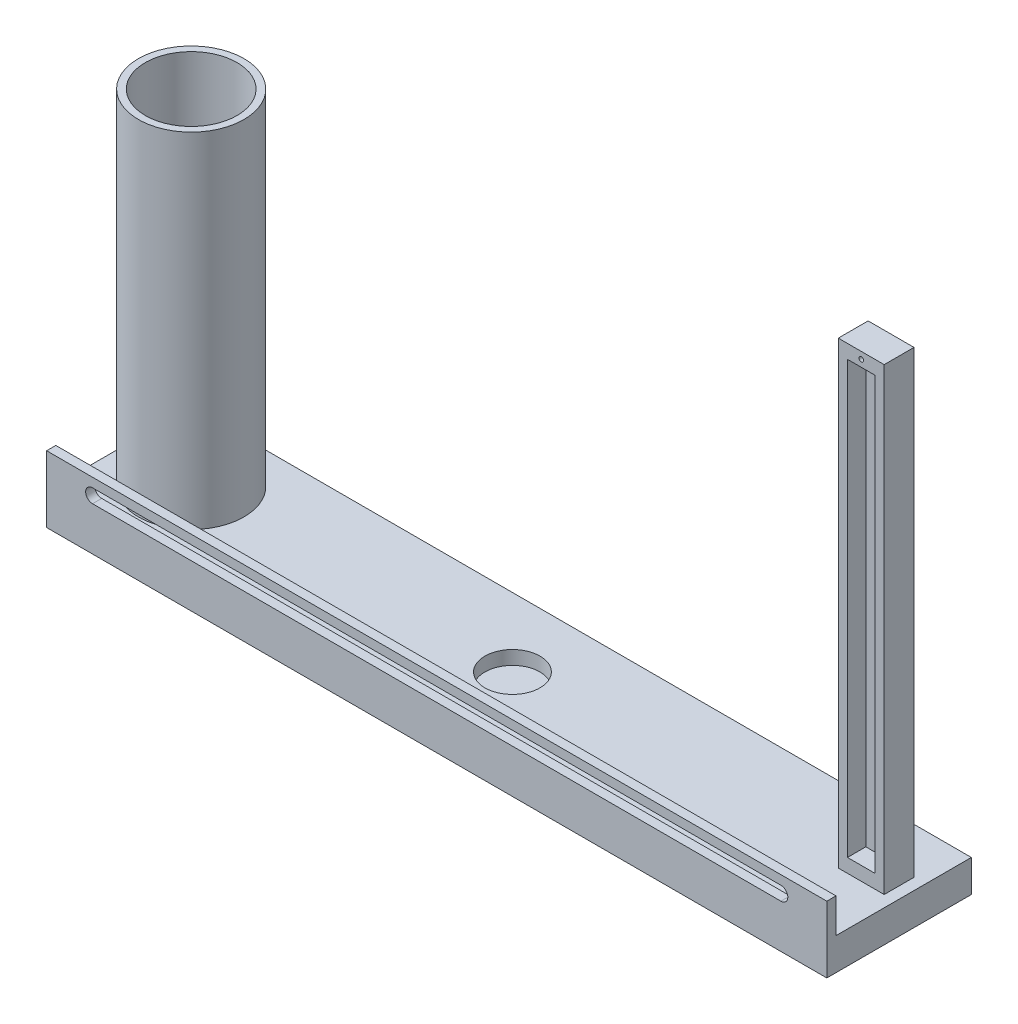
ISO-10303-21;
HEADER;
FILE_DESCRIPTION(('STEP AP214'),'2;1');
FILE_NAME('part.step','',(''),(''),'','','');
FILE_SCHEMA(('AUTOMOTIVE_DESIGN { 1 0 10303 214 1 1 1 1 }'));
ENDSEC;
DATA;
#1=APPLICATION_CONTEXT('core data for automotive mechanical design processes');
#2=APPLICATION_PROTOCOL_DEFINITION('international standard','automotive_design',2000,#1);
#3=PRODUCT_CONTEXT('',#1,'mechanical');
#4=PRODUCT('Part','Part','',(#3));
#5=PRODUCT_RELATED_PRODUCT_CATEGORY('part','',(#4));
#6=PRODUCT_DEFINITION_FORMATION('','',#4);
#7=PRODUCT_DEFINITION_CONTEXT('part definition',#1,'design');
#8=PRODUCT_DEFINITION('design','',#6,#7);
#9=PRODUCT_DEFINITION_SHAPE('','',#8);
#10=(LENGTH_UNIT() NAMED_UNIT(*) SI_UNIT(.MILLI.,.METRE.));
#11=(NAMED_UNIT(*) PLANE_ANGLE_UNIT() SI_UNIT($,.RADIAN.));
#12=(NAMED_UNIT(*) SI_UNIT($,.STERADIAN.) SOLID_ANGLE_UNIT());
#13=UNCERTAINTY_MEASURE_WITH_UNIT(LENGTH_MEASURE(1.E-05),#10,'distance_accuracy_value','');
#14=(GEOMETRIC_REPRESENTATION_CONTEXT(3) GLOBAL_UNCERTAINTY_ASSIGNED_CONTEXT((#13)) GLOBAL_UNIT_ASSIGNED_CONTEXT((#10,
#11,#12)) REPRESENTATION_CONTEXT('',''));
#15=CARTESIAN_POINT('',(0.,0.,0.));
#16=DIRECTION('',(0.,0.,1.));
#17=DIRECTION('',(1.,0.,0.));
#18=AXIS2_PLACEMENT_3D('',#15,#16,#17);
#19=CARTESIAN_POINT('',(0.,7.00000000225,-1.99999999224985));
#20=DIRECTION('',(0.,-1.,0.));
#21=DIRECTION('',(0.,0.,-1.));
#22=AXIS2_PLACEMENT_3D('',#19,#20,#21);
#23=PLANE('',#22);
#24=CARTESIAN_POINT('',(85.,7.00000000225,-16.5));
#25=DIRECTION('',(0.,1.,0.));
#26=DIRECTION('',(0.,0.,1.));
#27=AXIS2_PLACEMENT_3D('',#24,#25,#26);
#28=CIRCLE('',#27,5.99999999999999);
#29=CARTESIAN_POINT('',(85.,7.00000000225,-10.5));
#30=VERTEX_POINT('',#29);
#31=EDGE_CURVE('E644',#30,#30,#28,.T.);
#32=ORIENTED_EDGE('',*,*,#31,.F.);
#33=EDGE_LOOP('',(#32));
#34=FACE_BOUND('',#33,.T.);
#35=CARTESIAN_POINT('',(15.,7.00000000000001,-16.5));
#36=DIRECTION('',(0.,-1.,0.));
#37=DIRECTION('',(0.,0.,-1.));
#38=AXIS2_PLACEMENT_3D('',#35,#36,#37);
#39=CIRCLE('',#38,11.5);
#40=CARTESIAN_POINT('',(15.,7.00000000000001,-28.));
#41=VERTEX_POINT('',#40);
#42=EDGE_CURVE('E649',#41,#41,#39,.T.);
#43=ORIENTED_EDGE('',*,*,#42,.T.);
#44=EDGE_LOOP('',(#43));
#45=FACE_BOUND('',#44,.T.);
#46=DIRECTION('',(0.,0.,-1.));
#47=VECTOR('',#46,1.);
#48=CARTESIAN_POINT('',(170.,7.00000000225,-1.99999999225));
#49=LINE('',#48,#47);
#50=CARTESIAN_POINT('',(170.,7.00000000225,-1.99999999225));
#51=VERTEX_POINT('',#50);
#52=CARTESIAN_POINT('',(170.,7.00000000225,-31.5));
#53=VERTEX_POINT('',#52);
#54=EDGE_CURVE('E258',#51,#53,#49,.T.);
#55=ORIENTED_EDGE('',*,*,#54,.T.);
#56=DIRECTION('',(1.,0.,0.));
#57=VECTOR('',#56,1.);
#58=CARTESIAN_POINT('',(0.,7.00000000225,-31.4999999999998));
#59=LINE('',#58,#57);
#60=CARTESIAN_POINT('',(0.,7.00000000225,-31.4999999999998));
#61=VERTEX_POINT('',#60);
#62=EDGE_CURVE('E268',#61,#53,#59,.T.);
#63=ORIENTED_EDGE('',*,*,#62,.F.);
#64=DIRECTION('',(0.,0.,-1.));
#65=VECTOR('',#64,1.);
#66=CARTESIAN_POINT('',(0.,7.00000000225,-1.99999999224985));
#67=LINE('',#66,#65);
#68=CARTESIAN_POINT('',(0.,7.00000000225,-1.99999999224985));
#69=VERTEX_POINT('',#68);
#70=EDGE_CURVE('E257',#69,#61,#67,.T.);
#71=ORIENTED_EDGE('',*,*,#70,.F.);
#72=DIRECTION('',(1.,0.,0.));
#73=VECTOR('',#72,1.);
#74=CARTESIAN_POINT('',(0.,7.00000000225,-1.99999999224985));
#75=LINE('',#74,#73);
#76=EDGE_CURVE('E261',#69,#51,#75,.T.);
#77=ORIENTED_EDGE('',*,*,#76,.T.);
#78=EDGE_LOOP('',(#55,#63,#71,#77));
#79=FACE_BOUND('',#78,.T.);
#80=DIRECTION('',(1.,0.,0.));
#81=VECTOR('',#80,1.);
#82=CARTESIAN_POINT('',(167.500000015,7.00000000225,-14.99999999925));
#83=LINE('',#82,#81);
#84=CARTESIAN_POINT('',(157.49999999,7.00000000225,-14.99999999925));
#85=VERTEX_POINT('',#84);
#86=CARTESIAN_POINT('',(167.500000015,7.00000000225,-14.99999999925));
#87=VERTEX_POINT('',#86);
#88=EDGE_CURVE('E200',#85,#87,#83,.T.);
#89=ORIENTED_EDGE('',*,*,#88,.F.);
#90=DIRECTION('',(0.,0.,1.));
#91=VECTOR('',#90,1.);
#92=CARTESIAN_POINT('',(157.49999999,7.00000000225,-14.99999999925));
#93=LINE('',#92,#91);
#94=CARTESIAN_POINT('',(157.49999999,7.00000000225,-21.499999998875));
#95=VERTEX_POINT('',#94);
#96=EDGE_CURVE('E208',#95,#85,#93,.T.);
#97=ORIENTED_EDGE('',*,*,#96,.F.);
#98=DIRECTION('',(-1.,0.,0.));
#99=VECTOR('',#98,1.);
#100=CARTESIAN_POINT('',(157.49999999,7.00000000225,-21.499999998875));
#101=LINE('',#100,#99);
#102=CARTESIAN_POINT('',(167.500000015,7.00000000225,-21.499999998875));
#103=VERTEX_POINT('',#102);
#104=EDGE_CURVE('E218',#103,#95,#101,.T.);
#105=ORIENTED_EDGE('',*,*,#104,.F.);
#106=DIRECTION('',(0.,0.,-1.));
#107=VECTOR('',#106,1.);
#108=CARTESIAN_POINT('',(167.500000015,7.00000000225,-21.499999998875));
#109=LINE('',#108,#107);
#110=EDGE_CURVE('E60',#87,#103,#109,.T.);
#111=ORIENTED_EDGE('',*,*,#110,.F.);
#112=EDGE_LOOP('',(#89,#97,#105,#111));
#113=FACE_BOUND('',#112,.T.);
#114=ADVANCED_FACE('F37',(#34,#45,#79,#113),#23,.F.);
#115=CARTESIAN_POINT('',(170.,14.5,0.));
#116=DIRECTION('',(0.,0.,1.));
#117=DIRECTION('',(1.,0.,0.));
#118=AXIS2_PLACEMENT_3D('',#115,#116,#117);
#119=PLANE('',#118);
#120=CARTESIAN_POINT('',(160.,11.00000000075,0.));
#121=DIRECTION('',(0.,0.,1.));
#122=DIRECTION('',(1.,0.,0.));
#123=AXIS2_PLACEMENT_3D('',#120,#121,#122);
#124=CIRCLE('',#123,1.49999999925001);
#125=CARTESIAN_POINT('',(160.,9.5000000015,0.));
#126=VERTEX_POINT('',#125);
#127=CARTESIAN_POINT('',(160.,12.5,0.));
#128=VERTEX_POINT('',#127);
#129=EDGE_CURVE('E233',#126,#128,#124,.T.);
#130=ORIENTED_EDGE('',*,*,#129,.F.);
#131=DIRECTION('',(1.,0.,0.));
#132=VECTOR('',#131,1.);
#133=CARTESIAN_POINT('',(10.,9.50000000150001,0.));
#134=LINE('',#133,#132);
#135=CARTESIAN_POINT('',(10.,9.5000000015,0.));
#136=VERTEX_POINT('',#135);
#137=EDGE_CURVE('E241',#136,#126,#134,.T.);
#138=ORIENTED_EDGE('',*,*,#137,.F.);
#139=CARTESIAN_POINT('',(10.,11.00000000075,0.));
#140=DIRECTION('',(0.,0.,1.));
#141=DIRECTION('',(1.,0.,0.));
#142=AXIS2_PLACEMENT_3D('',#139,#140,#141);
#143=CIRCLE('',#142,1.49999999925);
#144=CARTESIAN_POINT('',(10.,12.5,0.));
#145=VERTEX_POINT('',#144);
#146=EDGE_CURVE('E238',#145,#136,#143,.T.);
#147=ORIENTED_EDGE('',*,*,#146,.F.);
#148=DIRECTION('',(-1.,0.,0.));
#149=VECTOR('',#148,1.);
#150=CARTESIAN_POINT('',(160.,12.5,0.));
#151=LINE('',#150,#149);
#152=EDGE_CURVE('E235',#128,#145,#151,.T.);
#153=ORIENTED_EDGE('',*,*,#152,.F.);
#154=EDGE_LOOP('',(#130,#138,#147,#153));
#155=FACE_BOUND('',#154,.T.);
#156=DIRECTION('',(-1.,0.,0.));
#157=VECTOR('',#156,1.);
#158=CARTESIAN_POINT('',(170.,0.,0.));
#159=LINE('',#158,#157);
#160=CARTESIAN_POINT('',(170.,0.,0.));
#161=VERTEX_POINT('',#160);
#162=CARTESIAN_POINT('',(0.,0.,0.));
#163=VERTEX_POINT('',#162);
#164=EDGE_CURVE('E267',#161,#163,#159,.T.);
#165=ORIENTED_EDGE('',*,*,#164,.F.);
#166=DIRECTION('',(0.,-1.,0.));
#167=VECTOR('',#166,1.);
#168=CARTESIAN_POINT('',(170.,14.5,0.));
#169=LINE('',#168,#167);
#170=CARTESIAN_POINT('',(170.,14.5,0.));
#171=VERTEX_POINT('',#170);
#172=EDGE_CURVE('E292',#171,#161,#169,.T.);
#173=ORIENTED_EDGE('',*,*,#172,.F.);
#174=DIRECTION('',(-1.,0.,0.));
#175=VECTOR('',#174,1.);
#176=CARTESIAN_POINT('',(170.,14.5,0.));
#177=LINE('',#176,#175);
#178=CARTESIAN_POINT('',(0.,14.5,0.));
#179=VERTEX_POINT('',#178);
#180=EDGE_CURVE('E272',#171,#179,#177,.T.);
#181=ORIENTED_EDGE('',*,*,#180,.T.);
#182=DIRECTION('',(0.,-1.,0.));
#183=VECTOR('',#182,1.);
#184=CARTESIAN_POINT('',(0.,14.5,0.));
#185=LINE('',#184,#183);
#186=EDGE_CURVE('E281',#179,#163,#185,.T.);
#187=ORIENTED_EDGE('',*,*,#186,.T.);
#188=EDGE_LOOP('',(#165,#173,#181,#187));
#189=FACE_BOUND('',#188,.T.);
#190=ADVANCED_FACE('F39',(#155,#189),#119,.T.);
#191=CARTESIAN_POINT('',(170.,14.5,-31.5));
#192=DIRECTION('',(1.,0.,0.));
#193=DIRECTION('',(0.,0.,-1.));
#194=AXIS2_PLACEMENT_3D('',#191,#192,#193);
#195=PLANE('',#194);
#196=DIRECTION('',(0.,-1.,0.));
#197=VECTOR('',#196,1.);
#198=CARTESIAN_POINT('',(170.,14.5,-1.99999999225));
#199=LINE('',#198,#197);
#200=CARTESIAN_POINT('',(170.,14.5,-1.99999999225));
#201=VERTEX_POINT('',#200);
#202=EDGE_CURVE('E247',#201,#51,#199,.T.);
#203=ORIENTED_EDGE('',*,*,#202,.F.);
#204=DIRECTION('',(0.,0.,1.));
#205=VECTOR('',#204,1.);
#206=CARTESIAN_POINT('',(170.,14.5,-31.5));
#207=LINE('',#206,#205);
#208=EDGE_CURVE('E279',#201,#171,#207,.T.);
#209=ORIENTED_EDGE('',*,*,#208,.T.);
#210=ORIENTED_EDGE('',*,*,#172,.T.);
#211=DIRECTION('',(0.,0.,1.));
#212=VECTOR('',#211,1.);
#213=CARTESIAN_POINT('',(170.,0.,-31.5));
#214=LINE('',#213,#212);
#215=CARTESIAN_POINT('',(170.,0.,-31.5));
#216=VERTEX_POINT('',#215);
#217=EDGE_CURVE('E276',#216,#161,#214,.T.);
#218=ORIENTED_EDGE('',*,*,#217,.F.);
#219=DIRECTION('',(0.,-1.,0.));
#220=VECTOR('',#219,1.);
#221=CARTESIAN_POINT('',(170.,14.5,-31.5));
#222=LINE('',#221,#220);
#223=EDGE_CURVE('E295',#53,#216,#222,.T.);
#224=ORIENTED_EDGE('',*,*,#223,.F.);
#225=ORIENTED_EDGE('',*,*,#54,.F.);
#226=EDGE_LOOP('',(#203,#209,#210,#218,#224,#225));
#227=FACE_BOUND('',#226,.T.);
#228=ADVANCED_FACE('F344',(#227),#195,.T.);
#229=CARTESIAN_POINT('',(0.,14.5,-31.5));
#230=DIRECTION('',(0.,0.,-1.));
#231=DIRECTION('',(-1.,0.,0.));
#232=AXIS2_PLACEMENT_3D('',#229,#230,#231);
#233=PLANE('',#232);
#234=ORIENTED_EDGE('',*,*,#62,.T.);
#235=ORIENTED_EDGE('',*,*,#223,.T.);
#236=DIRECTION('',(1.,0.,0.));
#237=VECTOR('',#236,1.);
#238=CARTESIAN_POINT('',(0.,0.,-31.5));
#239=LINE('',#238,#237);
#240=CARTESIAN_POINT('',(0.,0.,-31.5));
#241=VERTEX_POINT('',#240);
#242=EDGE_CURVE('E287',#241,#216,#239,.T.);
#243=ORIENTED_EDGE('',*,*,#242,.F.);
#244=DIRECTION('',(0.,-1.,0.));
#245=VECTOR('',#244,1.);
#246=CARTESIAN_POINT('',(0.,14.5,-31.5));
#247=LINE('',#246,#245);
#248=EDGE_CURVE('E297',#61,#241,#247,.T.);
#249=ORIENTED_EDGE('',*,*,#248,.F.);
#250=EDGE_LOOP('',(#234,#235,#243,#249));
#251=FACE_BOUND('',#250,.T.);
#252=ADVANCED_FACE('F361',(#251),#233,.T.);
#253=CARTESIAN_POINT('',(0.,14.5,0.));
#254=DIRECTION('',(-1.,0.,0.));
#255=DIRECTION('',(0.,0.,1.));
#256=AXIS2_PLACEMENT_3D('',#253,#254,#255);
#257=PLANE('',#256);
#258=DIRECTION('',(0.,-1.,0.));
#259=VECTOR('',#258,1.);
#260=CARTESIAN_POINT('',(0.,14.5,-1.99999999224985));
#261=LINE('',#260,#259);
#262=CARTESIAN_POINT('',(0.,14.5,-1.99999999224985));
#263=VERTEX_POINT('',#262);
#264=EDGE_CURVE('E254',#263,#69,#261,.T.);
#265=ORIENTED_EDGE('',*,*,#264,.T.);
#266=ORIENTED_EDGE('',*,*,#70,.T.);
#267=ORIENTED_EDGE('',*,*,#248,.T.);
#268=DIRECTION('',(0.,0.,-1.));
#269=VECTOR('',#268,1.);
#270=CARTESIAN_POINT('',(0.,0.,0.));
#271=LINE('',#270,#269);
#272=EDGE_CURVE('E284',#163,#241,#271,.T.);
#273=ORIENTED_EDGE('',*,*,#272,.F.);
#274=ORIENTED_EDGE('',*,*,#186,.F.);
#275=DIRECTION('',(0.,0.,-1.));
#276=VECTOR('',#275,1.);
#277=CARTESIAN_POINT('',(0.,14.5,0.));
#278=LINE('',#277,#276);
#279=EDGE_CURVE('E275',#179,#263,#278,.T.);
#280=ORIENTED_EDGE('',*,*,#279,.T.);
#281=EDGE_LOOP('',(#265,#266,#267,#273,#274,#280));
#282=FACE_BOUND('',#281,.T.);
#283=ADVANCED_FACE('F354',(#282),#257,.T.);
#284=CARTESIAN_POINT('',(0.,14.5,0.));
#285=DIRECTION('',(0.,-1.,0.));
#286=DIRECTION('',(0.,0.,-1.));
#287=AXIS2_PLACEMENT_3D('',#284,#285,#286);
#288=PLANE('',#287);
#289=ORIENTED_EDGE('',*,*,#208,.F.);
#290=DIRECTION('',(1.,0.,0.));
#291=VECTOR('',#290,1.);
#292=CARTESIAN_POINT('',(0.,14.5,-1.99999999224985));
#293=LINE('',#292,#291);
#294=EDGE_CURVE('E265',#263,#201,#293,.T.);
#295=ORIENTED_EDGE('',*,*,#294,.F.);
#296=ORIENTED_EDGE('',*,*,#279,.F.);
#297=ORIENTED_EDGE('',*,*,#180,.F.);
#298=EDGE_LOOP('',(#289,#295,#296,#297));
#299=FACE_BOUND('',#298,.T.);
#300=ADVANCED_FACE('F351',(#299),#288,.F.);
#301=CARTESIAN_POINT('',(0.,0.,0.));
#302=DIRECTION('',(0.,-1.,0.));
#303=DIRECTION('',(0.,0.,-1.));
#304=AXIS2_PLACEMENT_3D('',#301,#302,#303);
#305=PLANE('',#304);
#306=ORIENTED_EDGE('',*,*,#164,.T.);
#307=ORIENTED_EDGE('',*,*,#272,.T.);
#308=ORIENTED_EDGE('',*,*,#242,.T.);
#309=ORIENTED_EDGE('',*,*,#217,.T.);
#310=EDGE_LOOP('',(#306,#307,#308,#309));
#311=FACE_BOUND('',#310,.T.);
#312=ADVANCED_FACE('F350',(#311),#305,.T.);
#313=CARTESIAN_POINT('',(0.,14.5,-1.99999999224985));
#314=DIRECTION('',(0.,0.,1.));
#315=DIRECTION('',(1.,0.,0.));
#316=AXIS2_PLACEMENT_3D('',#313,#314,#315);
#317=PLANE('',#316);
#318=DIRECTION('',(1.,0.,0.));
#319=VECTOR('',#318,1.);
#320=CARTESIAN_POINT('',(0.,9.50000000150001,-1.99999999224985));
#321=LINE('',#320,#319);
#322=CARTESIAN_POINT('',(10.,9.5000000015,-1.99999999224986));
#323=VERTEX_POINT('',#322);
#324=CARTESIAN_POINT('',(160.,9.5000000015,-1.99999999224992));
#325=VERTEX_POINT('',#324);
#326=EDGE_CURVE('E45',#323,#325,#321,.T.);
#327=ORIENTED_EDGE('',*,*,#326,.T.);
#328=CARTESIAN_POINT('',(160.,11.00000000075,-1.99999999224999));
#329=DIRECTION('',(0.,0.,1.));
#330=DIRECTION('',(1.,0.,0.));
#331=AXIS2_PLACEMENT_3D('',#328,#329,#330);
#332=CIRCLE('',#331,1.49999999925001);
#333=CARTESIAN_POINT('',(160.,12.5,-1.99999999224992));
#334=VERTEX_POINT('',#333);
#335=EDGE_CURVE('E11',#325,#334,#332,.T.);
#336=ORIENTED_EDGE('',*,*,#335,.T.);
#337=DIRECTION('',(-1.,0.,0.));
#338=VECTOR('',#337,1.);
#339=CARTESIAN_POINT('',(0.,12.5,-1.99999999224985));
#340=LINE('',#339,#338);
#341=CARTESIAN_POINT('',(10.,12.5,-1.99999999224986));
#342=VERTEX_POINT('',#341);
#343=EDGE_CURVE('E294',#334,#342,#340,.T.);
#344=ORIENTED_EDGE('',*,*,#343,.T.);
#345=CARTESIAN_POINT('',(10.,11.00000000075,-1.99999999224986));
#346=DIRECTION('',(0.,0.,1.));
#347=DIRECTION('',(1.,0.,0.));
#348=AXIS2_PLACEMENT_3D('',#345,#346,#347);
#349=CIRCLE('',#348,1.49999999925);
#350=EDGE_CURVE('E302',#342,#323,#349,.T.);
#351=ORIENTED_EDGE('',*,*,#350,.T.);
#352=EDGE_LOOP('',(#327,#336,#344,#351));
#353=FACE_BOUND('',#352,.T.);
#354=ORIENTED_EDGE('',*,*,#202,.T.);
#355=ORIENTED_EDGE('',*,*,#76,.F.);
#356=ORIENTED_EDGE('',*,*,#264,.F.);
#357=ORIENTED_EDGE('',*,*,#294,.T.);
#358=EDGE_LOOP('',(#354,#355,#356,#357));
#359=FACE_BOUND('',#358,.T.);
#360=ADVANCED_FACE('F306',(#353,#359),#317,.F.);
#361=CARTESIAN_POINT('',(160.,11.00000000075,-31.5));
#362=DIRECTION('',(0.,0.,1.));
#363=DIRECTION('',(1.,0.,0.));
#364=AXIS2_PLACEMENT_3D('',#361,#362,#363);
#365=CYLINDRICAL_SURFACE('',#364,1.49999999925001);
#366=DIRECTION('',(0.,0.,1.));
#367=VECTOR('',#366,1.);
#368=CARTESIAN_POINT('',(160.,9.5000000015,-31.5));
#369=LINE('',#368,#367);
#370=EDGE_CURVE('E245',#325,#126,#369,.T.);
#371=ORIENTED_EDGE('',*,*,#370,.T.);
#372=ORIENTED_EDGE('',*,*,#129,.T.);
#373=DIRECTION('',(0.,0.,1.));
#374=VECTOR('',#373,1.);
#375=CARTESIAN_POINT('',(160.,12.5,-31.5));
#376=LINE('',#375,#374);
#377=EDGE_CURVE('E244',#334,#128,#376,.T.);
#378=ORIENTED_EDGE('',*,*,#377,.F.);
#379=ORIENTED_EDGE('',*,*,#335,.F.);
#380=EDGE_LOOP('',(#371,#372,#378,#379));
#381=FACE_BOUND('',#380,.T.);
#382=ADVANCED_FACE('F323',(#381),#365,.F.);
#383=CARTESIAN_POINT('',(10.,9.50000000150001,-31.5));
#384=DIRECTION('',(0.,-1.,0.));
#385=DIRECTION('',(1.,0.,0.));
#386=AXIS2_PLACEMENT_3D('',#383,#384,#385);
#387=PLANE('',#386);
#388=DIRECTION('',(0.,0.,1.));
#389=VECTOR('',#388,1.);
#390=CARTESIAN_POINT('',(10.,9.5000000015,-31.5));
#391=LINE('',#390,#389);
#392=EDGE_CURVE('E248',#323,#136,#391,.T.);
#393=ORIENTED_EDGE('',*,*,#392,.T.);
#394=ORIENTED_EDGE('',*,*,#137,.T.);
#395=ORIENTED_EDGE('',*,*,#370,.F.);
#396=ORIENTED_EDGE('',*,*,#326,.F.);
#397=EDGE_LOOP('',(#393,#394,#395,#396));
#398=FACE_BOUND('',#397,.T.);
#399=ADVANCED_FACE('F312',(#398),#387,.F.);
#400=CARTESIAN_POINT('',(10.,11.00000000075,-31.5));
#401=DIRECTION('',(0.,0.,1.));
#402=DIRECTION('',(1.,0.,0.));
#403=AXIS2_PLACEMENT_3D('',#400,#401,#402);
#404=CYLINDRICAL_SURFACE('',#403,1.49999999925);
#405=DIRECTION('',(0.,0.,1.));
#406=VECTOR('',#405,1.);
#407=CARTESIAN_POINT('',(10.,12.5,-31.5));
#408=LINE('',#407,#406);
#409=EDGE_CURVE('E250',#342,#145,#408,.T.);
#410=ORIENTED_EDGE('',*,*,#409,.T.);
#411=ORIENTED_EDGE('',*,*,#146,.T.);
#412=ORIENTED_EDGE('',*,*,#392,.F.);
#413=ORIENTED_EDGE('',*,*,#350,.F.);
#414=EDGE_LOOP('',(#410,#411,#412,#413));
#415=FACE_BOUND('',#414,.T.);
#416=ADVANCED_FACE('F314',(#415),#404,.F.);
#417=CARTESIAN_POINT('',(160.,12.5,-31.5));
#418=DIRECTION('',(0.,1.,0.));
#419=DIRECTION('',(-1.,0.,0.));
#420=AXIS2_PLACEMENT_3D('',#417,#418,#419);
#421=PLANE('',#420);
#422=ORIENTED_EDGE('',*,*,#377,.T.);
#423=ORIENTED_EDGE('',*,*,#152,.T.);
#424=ORIENTED_EDGE('',*,*,#409,.F.);
#425=ORIENTED_EDGE('',*,*,#343,.F.);
#426=EDGE_LOOP('',(#422,#423,#424,#425));
#427=FACE_BOUND('',#426,.T.);
#428=ADVANCED_FACE('F325',(#427),#421,.F.);
#429=CARTESIAN_POINT('',(167.500000015,107.00000000225,-14.99999999925));
#430=DIRECTION('',(0.,0.,-1.));
#431=DIRECTION('',(-1.,0.,0.));
#432=AXIS2_PLACEMENT_3D('',#429,#430,#431);
#433=PLANE('',#432);
#434=CARTESIAN_POINT('',(162.5,105.5,-14.99999999925));
#435=DIRECTION('',(0.,0.,1.));
#436=DIRECTION('',(1.,0.,0.));
#437=AXIS2_PLACEMENT_3D('',#434,#435,#436);
#438=CIRCLE('',#437,0.5);
#439=CARTESIAN_POINT('',(163.,105.5,-14.99999999925));
#440=VERTEX_POINT('',#439);
#441=EDGE_CURVE('E636',#440,#440,#438,.T.);
#442=ORIENTED_EDGE('',*,*,#441,.F.);
#443=EDGE_LOOP('',(#442));
#444=FACE_BOUND('',#443,.T.);
#445=DIRECTION('',(-1.,0.,0.));
#446=VECTOR('',#445,1.);
#447=CARTESIAN_POINT('',(165.5,104.,-14.99999999925));
#448=LINE('',#447,#446);
#449=CARTESIAN_POINT('',(165.5,104.,-14.99999999925));
#450=VERTEX_POINT('',#449);
#451=CARTESIAN_POINT('',(159.5,104.,-14.99999999925));
#452=VERTEX_POINT('',#451);
#453=EDGE_CURVE('E194',#450,#452,#448,.T.);
#454=ORIENTED_EDGE('',*,*,#453,.F.);
#455=DIRECTION('',(0.,1.,0.));
#456=VECTOR('',#455,1.);
#457=CARTESIAN_POINT('',(165.5,10.,-14.99999999925));
#458=LINE('',#457,#456);
#459=CARTESIAN_POINT('',(165.5,10.,-14.99999999925));
#460=VERTEX_POINT('',#459);
#461=EDGE_CURVE('E52',#460,#450,#458,.T.);
#462=ORIENTED_EDGE('',*,*,#461,.F.);
#463=DIRECTION('',(1.,0.,0.));
#464=VECTOR('',#463,1.);
#465=CARTESIAN_POINT('',(159.5,10.,-14.99999999925));
#466=LINE('',#465,#464);
#467=CARTESIAN_POINT('',(159.5,10.,-14.99999999925));
#468=VERTEX_POINT('',#467);
#469=EDGE_CURVE('E182',#468,#460,#466,.T.);
#470=ORIENTED_EDGE('',*,*,#469,.F.);
#471=DIRECTION('',(0.,-1.,0.));
#472=VECTOR('',#471,1.);
#473=CARTESIAN_POINT('',(159.5,104.,-14.99999999925));
#474=LINE('',#473,#472);
#475=EDGE_CURVE('E185',#452,#468,#474,.T.);
#476=ORIENTED_EDGE('',*,*,#475,.F.);
#477=EDGE_LOOP('',(#454,#462,#470,#476));
#478=FACE_BOUND('',#477,.T.);
#479=ORIENTED_EDGE('',*,*,#88,.T.);
#480=DIRECTION('',(0.,-1.,0.));
#481=VECTOR('',#480,1.);
#482=CARTESIAN_POINT('',(167.500000015,107.00000000225,-14.99999999925));
#483=LINE('',#482,#481);
#484=CARTESIAN_POINT('',(167.500000015,107.00000000225,-14.99999999925));
#485=VERTEX_POINT('',#484);
#486=EDGE_CURVE('E231',#485,#87,#483,.T.);
#487=ORIENTED_EDGE('',*,*,#486,.F.);
#488=DIRECTION('',(1.,0.,0.));
#489=VECTOR('',#488,1.);
#490=CARTESIAN_POINT('',(167.500000015,107.00000000225,-14.99999999925));
#491=LINE('',#490,#489);
#492=CARTESIAN_POINT('',(157.49999999,107.00000000225,-14.99999999925));
#493=VERTEX_POINT('',#492);
#494=EDGE_CURVE('E204',#493,#485,#491,.T.);
#495=ORIENTED_EDGE('',*,*,#494,.F.);
#496=DIRECTION('',(0.,-1.,0.));
#497=VECTOR('',#496,1.);
#498=CARTESIAN_POINT('',(157.49999999,107.00000000225,-14.99999999925));
#499=LINE('',#498,#497);
#500=EDGE_CURVE('E214',#493,#85,#499,.T.);
#501=ORIENTED_EDGE('',*,*,#500,.T.);
#502=EDGE_LOOP('',(#479,#487,#495,#501));
#503=FACE_BOUND('',#502,.T.);
#504=ADVANCED_FACE('F327',(#444,#478,#503),#433,.F.);
#505=CARTESIAN_POINT('',(167.500000015,107.00000000225,-21.499999998875));
#506=DIRECTION('',(-1.,0.,0.));
#507=DIRECTION('',(0.,0.,1.));
#508=AXIS2_PLACEMENT_3D('',#505,#506,#507);
#509=PLANE('',#508);
#510=ORIENTED_EDGE('',*,*,#110,.T.);
#511=DIRECTION('',(0.,-1.,0.));
#512=VECTOR('',#511,1.);
#513=CARTESIAN_POINT('',(167.500000015,107.00000000225,-21.499999998875));
#514=LINE('',#513,#512);
#515=CARTESIAN_POINT('',(167.500000015,107.00000000225,-21.499999998875));
#516=VERTEX_POINT('',#515);
#517=EDGE_CURVE('E228',#516,#103,#514,.T.);
#518=ORIENTED_EDGE('',*,*,#517,.F.);
#519=DIRECTION('',(0.,0.,-1.));
#520=VECTOR('',#519,1.);
#521=CARTESIAN_POINT('',(167.500000015,107.00000000225,-21.499999998875));
#522=LINE('',#521,#520);
#523=EDGE_CURVE('E207',#485,#516,#522,.T.);
#524=ORIENTED_EDGE('',*,*,#523,.F.);
#525=ORIENTED_EDGE('',*,*,#486,.T.);
#526=EDGE_LOOP('',(#510,#518,#524,#525));
#527=FACE_BOUND('',#526,.T.);
#528=ADVANCED_FACE('F333',(#527),#509,.F.);
#529=CARTESIAN_POINT('',(157.49999999,107.00000000225,-21.499999998875));
#530=DIRECTION('',(0.,0.,1.));
#531=DIRECTION('',(1.,0.,0.));
#532=AXIS2_PLACEMENT_3D('',#529,#530,#531);
#533=PLANE('',#532);
#534=ORIENTED_EDGE('',*,*,#104,.T.);
#535=DIRECTION('',(0.,-1.,0.));
#536=VECTOR('',#535,1.);
#537=CARTESIAN_POINT('',(157.49999999,107.00000000225,-21.499999998875));
#538=LINE('',#537,#536);
#539=CARTESIAN_POINT('',(157.49999999,107.00000000225,-21.499999998875));
#540=VERTEX_POINT('',#539);
#541=EDGE_CURVE('E225',#540,#95,#538,.T.);
#542=ORIENTED_EDGE('',*,*,#541,.F.);
#543=DIRECTION('',(-1.,0.,0.));
#544=VECTOR('',#543,1.);
#545=CARTESIAN_POINT('',(157.49999999,107.00000000225,-21.499999998875));
#546=LINE('',#545,#544);
#547=EDGE_CURVE('E210',#516,#540,#546,.T.);
#548=ORIENTED_EDGE('',*,*,#547,.F.);
#549=ORIENTED_EDGE('',*,*,#517,.T.);
#550=EDGE_LOOP('',(#534,#542,#548,#549));
#551=FACE_BOUND('',#550,.T.);
#552=ADVANCED_FACE('F397',(#551),#533,.F.);
#553=CARTESIAN_POINT('',(157.49999999,107.00000000225,-14.99999999925));
#554=DIRECTION('',(1.,0.,0.));
#555=DIRECTION('',(0.,0.,-1.));
#556=AXIS2_PLACEMENT_3D('',#553,#554,#555);
#557=PLANE('',#556);
#558=ORIENTED_EDGE('',*,*,#96,.T.);
#559=ORIENTED_EDGE('',*,*,#500,.F.);
#560=DIRECTION('',(0.,0.,1.));
#561=VECTOR('',#560,1.);
#562=CARTESIAN_POINT('',(157.49999999,107.00000000225,-14.99999999925));
#563=LINE('',#562,#561);
#564=EDGE_CURVE('E212',#540,#493,#563,.T.);
#565=ORIENTED_EDGE('',*,*,#564,.F.);
#566=ORIENTED_EDGE('',*,*,#541,.T.);
#567=EDGE_LOOP('',(#558,#559,#565,#566));
#568=FACE_BOUND('',#567,.T.);
#569=ADVANCED_FACE('F388',(#568),#557,.F.);
#570=CARTESIAN_POINT('',(0.,107.00000000225,0.));
#571=DIRECTION('',(0.,-1.,0.));
#572=DIRECTION('',(0.,0.,-1.));
#573=AXIS2_PLACEMENT_3D('',#570,#571,#572);
#574=PLANE('',#573);
#575=ORIENTED_EDGE('',*,*,#494,.T.);
#576=ORIENTED_EDGE('',*,*,#523,.T.);
#577=ORIENTED_EDGE('',*,*,#547,.T.);
#578=ORIENTED_EDGE('',*,*,#564,.T.);
#579=EDGE_LOOP('',(#575,#576,#577,#578));
#580=FACE_BOUND('',#579,.T.);
#581=ADVANCED_FACE('F393',(#580),#574,.F.);
#582=CARTESIAN_POINT('',(165.5,10.,-18.99999999925));
#583=DIRECTION('',(1.,0.,0.));
#584=DIRECTION('',(0.,0.,-1.));
#585=AXIS2_PLACEMENT_3D('',#582,#583,#584);
#586=PLANE('',#585);
#587=ORIENTED_EDGE('',*,*,#461,.T.);
#588=DIRECTION('',(0.,0.,1.));
#589=VECTOR('',#588,1.);
#590=CARTESIAN_POINT('',(165.5,104.,-18.99999999925));
#591=LINE('',#590,#589);
#592=CARTESIAN_POINT('',(165.5,104.,-18.99999999925));
#593=VERTEX_POINT('',#592);
#594=EDGE_CURVE('E160',#593,#450,#591,.T.);
#595=ORIENTED_EDGE('',*,*,#594,.F.);
#596=DIRECTION('',(0.,1.,0.));
#597=VECTOR('',#596,1.);
#598=CARTESIAN_POINT('',(165.5,10.,-18.99999999925));
#599=LINE('',#598,#597);
#600=CARTESIAN_POINT('',(165.5,10.,-18.99999999925));
#601=VERTEX_POINT('',#600);
#602=EDGE_CURVE('E164',#601,#593,#599,.T.);
#603=ORIENTED_EDGE('',*,*,#602,.F.);
#604=DIRECTION('',(0.,0.,1.));
#605=VECTOR('',#604,1.);
#606=CARTESIAN_POINT('',(165.5,10.,-18.99999999925));
#607=LINE('',#606,#605);
#608=EDGE_CURVE('E198',#601,#460,#607,.T.);
#609=ORIENTED_EDGE('',*,*,#608,.T.);
#610=EDGE_LOOP('',(#587,#595,#603,#609));
#611=FACE_BOUND('',#610,.T.);
#612=ADVANCED_FACE('F162',(#611),#586,.F.);
#613=CARTESIAN_POINT('',(159.5,10.,-18.99999999925));
#614=DIRECTION('',(0.,-1.,0.));
#615=DIRECTION('',(0.,0.,-1.));
#616=AXIS2_PLACEMENT_3D('',#613,#614,#615);
#617=PLANE('',#616);
#618=ORIENTED_EDGE('',*,*,#469,.T.);
#619=ORIENTED_EDGE('',*,*,#608,.F.);
#620=DIRECTION('',(1.,0.,0.));
#621=VECTOR('',#620,1.);
#622=CARTESIAN_POINT('',(159.5,10.,-18.99999999925));
#623=LINE('',#622,#621);
#624=CARTESIAN_POINT('',(159.5,10.,-18.99999999925));
#625=VERTEX_POINT('',#624);
#626=EDGE_CURVE('E170',#625,#601,#623,.T.);
#627=ORIENTED_EDGE('',*,*,#626,.F.);
#628=DIRECTION('',(0.,0.,1.));
#629=VECTOR('',#628,1.);
#630=CARTESIAN_POINT('',(159.5,10.,-18.99999999925));
#631=LINE('',#630,#629);
#632=EDGE_CURVE('E201',#625,#468,#631,.T.);
#633=ORIENTED_EDGE('',*,*,#632,.T.);
#634=EDGE_LOOP('',(#618,#619,#627,#633));
#635=FACE_BOUND('',#634,.T.);
#636=ADVANCED_FACE('F511',(#635),#617,.F.);
#637=CARTESIAN_POINT('',(159.5,104.,-18.99999999925));
#638=DIRECTION('',(-1.,0.,0.));
#639=DIRECTION('',(0.,0.,1.));
#640=AXIS2_PLACEMENT_3D('',#637,#638,#639);
#641=PLANE('',#640);
#642=ORIENTED_EDGE('',*,*,#475,.T.);
#643=ORIENTED_EDGE('',*,*,#632,.F.);
#644=DIRECTION('',(0.,-1.,0.));
#645=VECTOR('',#644,1.);
#646=CARTESIAN_POINT('',(159.5,104.,-18.99999999925));
#647=LINE('',#646,#645);
#648=CARTESIAN_POINT('',(159.5,104.,-18.99999999925));
#649=VERTEX_POINT('',#648);
#650=EDGE_CURVE('E178',#649,#625,#647,.T.);
#651=ORIENTED_EDGE('',*,*,#650,.F.);
#652=DIRECTION('',(0.,0.,1.));
#653=VECTOR('',#652,1.);
#654=CARTESIAN_POINT('',(159.5,104.,-18.99999999925));
#655=LINE('',#654,#653);
#656=EDGE_CURVE('E169',#649,#452,#655,.T.);
#657=ORIENTED_EDGE('',*,*,#656,.T.);
#658=EDGE_LOOP('',(#642,#643,#651,#657));
#659=FACE_BOUND('',#658,.T.);
#660=ADVANCED_FACE('F519',(#659),#641,.F.);
#661=CARTESIAN_POINT('',(165.5,104.,-18.99999999925));
#662=DIRECTION('',(0.,1.,0.));
#663=DIRECTION('',(0.,0.,1.));
#664=AXIS2_PLACEMENT_3D('',#661,#662,#663);
#665=PLANE('',#664);
#666=ORIENTED_EDGE('',*,*,#453,.T.);
#667=ORIENTED_EDGE('',*,*,#656,.F.);
#668=DIRECTION('',(-1.,0.,0.));
#669=VECTOR('',#668,1.);
#670=CARTESIAN_POINT('',(165.5,104.,-18.99999999925));
#671=LINE('',#670,#669);
#672=EDGE_CURVE('E173',#593,#649,#671,.T.);
#673=ORIENTED_EDGE('',*,*,#672,.F.);
#674=ORIENTED_EDGE('',*,*,#594,.T.);
#675=EDGE_LOOP('',(#666,#667,#673,#674));
#676=FACE_BOUND('',#675,.T.);
#677=ADVANCED_FACE('F174',(#676),#665,.F.);
#678=CARTESIAN_POINT('',(0.,0.,-18.99999999925));
#679=DIRECTION('',(0.,0.,1.));
#680=DIRECTION('',(1.,0.,0.));
#681=AXIS2_PLACEMENT_3D('',#678,#679,#680);
#682=PLANE('',#681);
#683=ORIENTED_EDGE('',*,*,#602,.T.);
#684=ORIENTED_EDGE('',*,*,#672,.T.);
#685=ORIENTED_EDGE('',*,*,#650,.T.);
#686=ORIENTED_EDGE('',*,*,#626,.T.);
#687=EDGE_LOOP('',(#683,#684,#685,#686));
#688=FACE_BOUND('',#687,.T.);
#689=ADVANCED_FACE('F180',(#688),#682,.T.);
#690=CARTESIAN_POINT('',(15.,82.,-16.5));
#691=DIRECTION('',(0.,-1.,0.));
#692=DIRECTION('',(0.,0.,-1.));
#693=AXIS2_PLACEMENT_3D('',#690,#691,#692);
#694=CYLINDRICAL_SURFACE('',#693,11.5);
#695=CARTESIAN_POINT('',(15.,82.,-16.5));
#696=DIRECTION('',(0.,-1.,0.));
#697=DIRECTION('',(0.,0.,-1.));
#698=AXIS2_PLACEMENT_3D('',#695,#696,#697);
#699=CIRCLE('',#698,11.5);
#700=CARTESIAN_POINT('',(15.,82.,-28.));
#701=VERTEX_POINT('',#700);
#702=EDGE_CURVE('E188',#701,#701,#699,.T.);
#703=ORIENTED_EDGE('',*,*,#702,.T.);
#704=EDGE_LOOP('',(#703));
#705=FACE_BOUND('',#704,.T.);
#706=ORIENTED_EDGE('',*,*,#42,.F.);
#707=EDGE_LOOP('',(#706));
#708=FACE_BOUND('',#707,.T.);
#709=ADVANCED_FACE('F543',(#705,#708),#694,.T.);
#710=CARTESIAN_POINT('',(26.5,82.,-16.5));
#711=DIRECTION('',(0.,1.,0.));
#712=DIRECTION('',(0.,0.,1.));
#713=AXIS2_PLACEMENT_3D('',#710,#711,#712);
#714=PLANE('',#713);
#715=CARTESIAN_POINT('',(15.,82.,-16.5));
#716=DIRECTION('',(0.,1.,0.));
#717=DIRECTION('',(0.,0.,1.));
#718=AXIS2_PLACEMENT_3D('',#715,#716,#717);
#719=CIRCLE('',#718,9.99999999999999);
#720=CARTESIAN_POINT('',(15.,82.,-6.50000000000001));
#721=VERTEX_POINT('',#720);
#722=EDGE_CURVE('E634',#721,#721,#719,.T.);
#723=ORIENTED_EDGE('',*,*,#722,.F.);
#724=EDGE_LOOP('',(#723));
#725=FACE_BOUND('',#724,.T.);
#726=ORIENTED_EDGE('',*,*,#702,.F.);
#727=EDGE_LOOP('',(#726));
#728=FACE_BOUND('',#727,.T.);
#729=ADVANCED_FACE('F550',(#725,#728),#714,.T.);
#730=CARTESIAN_POINT('',(85.,4.00000000225001,-16.5));
#731=DIRECTION('',(0.,-1.,0.));
#732=DIRECTION('',(0.,0.,-1.));
#733=AXIS2_PLACEMENT_3D('',#730,#731,#732);
#734=PLANE('',#733);
#735=CARTESIAN_POINT('',(85.,4.00000000225,-16.5));
#736=DIRECTION('',(0.,1.,0.));
#737=DIRECTION('',(0.,0.,1.));
#738=AXIS2_PLACEMENT_3D('',#735,#736,#737);
#739=CIRCLE('',#738,5.99999999999999);
#740=CARTESIAN_POINT('',(85.,4.00000000225,-10.5));
#741=VERTEX_POINT('',#740);
#742=EDGE_CURVE('E647',#741,#741,#739,.T.);
#743=ORIENTED_EDGE('',*,*,#742,.T.);
#744=EDGE_LOOP('',(#743));
#745=FACE_BOUND('',#744,.T.);
#746=ADVANCED_FACE('F559',(#745),#734,.F.);
#747=CARTESIAN_POINT('',(85.,7.00000000225,-16.5));
#748=DIRECTION('',(0.,1.,0.));
#749=DIRECTION('',(0.,0.,1.));
#750=AXIS2_PLACEMENT_3D('',#747,#748,#749);
#751=CYLINDRICAL_SURFACE('',#750,5.99999999999999);
#752=ORIENTED_EDGE('',*,*,#742,.F.);
#753=EDGE_LOOP('',(#752));
#754=FACE_BOUND('',#753,.T.);
#755=ORIENTED_EDGE('',*,*,#31,.T.);
#756=EDGE_LOOP('',(#755));
#757=FACE_BOUND('',#756,.T.);
#758=ADVANCED_FACE('F569',(#754,#757),#751,.F.);
#759=CARTESIAN_POINT('',(162.5,105.5,-15.99999999925));
#760=DIRECTION('',(0.,0.,-1.));
#761=DIRECTION('',(-1.,0.,0.));
#762=AXIS2_PLACEMENT_3D('',#759,#760,#761);
#763=PLANE('',#762);
#764=CARTESIAN_POINT('',(162.5,105.5,-15.99999999925));
#765=DIRECTION('',(0.,0.,1.));
#766=DIRECTION('',(1.,0.,0.));
#767=AXIS2_PLACEMENT_3D('',#764,#765,#766);
#768=CIRCLE('',#767,0.5);
#769=CARTESIAN_POINT('',(163.,105.5,-15.99999999925));
#770=VERTEX_POINT('',#769);
#771=EDGE_CURVE('E641',#770,#770,#768,.T.);
#772=ORIENTED_EDGE('',*,*,#771,.T.);
#773=EDGE_LOOP('',(#772));
#774=FACE_BOUND('',#773,.T.);
#775=ADVANCED_FACE('F577',(#774),#763,.F.);
#776=CARTESIAN_POINT('',(162.5,105.5,-14.99999999925));
#777=DIRECTION('',(0.,0.,1.));
#778=DIRECTION('',(1.,0.,0.));
#779=AXIS2_PLACEMENT_3D('',#776,#777,#778);
#780=CYLINDRICAL_SURFACE('',#779,0.5);
#781=ORIENTED_EDGE('',*,*,#771,.F.);
#782=EDGE_LOOP('',(#781));
#783=FACE_BOUND('',#782,.T.);
#784=ORIENTED_EDGE('',*,*,#441,.T.);
#785=EDGE_LOOP('',(#784));
#786=FACE_BOUND('',#785,.T.);
#787=ADVANCED_FACE('F585',(#783,#786),#780,.F.);
#788=CARTESIAN_POINT('',(15.,3.00000000000002,-16.5));
#789=DIRECTION('',(0.,-1.,0.));
#790=DIRECTION('',(0.,0.,-1.));
#791=AXIS2_PLACEMENT_3D('',#788,#789,#790);
#792=PLANE('',#791);
#793=CARTESIAN_POINT('',(15.,3.,-16.5));
#794=DIRECTION('',(0.,1.,0.));
#795=DIRECTION('',(0.,0.,1.));
#796=AXIS2_PLACEMENT_3D('',#793,#794,#795);
#797=CIRCLE('',#796,9.99999999999997);
#798=CARTESIAN_POINT('',(15.,3.,-6.50000000000003));
#799=VERTEX_POINT('',#798);
#800=EDGE_CURVE('E631',#799,#799,#797,.T.);
#801=ORIENTED_EDGE('',*,*,#800,.T.);
#802=EDGE_LOOP('',(#801));
#803=FACE_BOUND('',#802,.T.);
#804=ADVANCED_FACE('F593',(#803),#792,.F.);
#805=CARTESIAN_POINT('',(15.,82.,-16.5));
#806=DIRECTION('',(0.,1.,0.));
#807=DIRECTION('',(0.,0.,1.));
#808=AXIS2_PLACEMENT_3D('',#805,#806,#807);
#809=CYLINDRICAL_SURFACE('',#808,9.99999999999998);
#810=ORIENTED_EDGE('',*,*,#800,.F.);
#811=EDGE_LOOP('',(#810));
#812=FACE_BOUND('',#811,.T.);
#813=ORIENTED_EDGE('',*,*,#722,.T.);
#814=EDGE_LOOP('',(#813));
#815=FACE_BOUND('',#814,.T.);
#816=ADVANCED_FACE('F601',(#812,#815),#809,.F.);
#817=CLOSED_SHELL('',(#114,#190,#228,#252,#283,#300,#312,#360,#382,#399,#416,#428,#504,#528,
#552,#569,#581,#612,#636,#660,#677,#689,#709,#729,#746,#758,#775,#787,#804,#816));
#818=MANIFOLD_SOLID_BREP('B2',#817);
#819=ADVANCED_BREP_SHAPE_REPRESENTATION('',(#18,#818),#14);
#820=SHAPE_DEFINITION_REPRESENTATION(#9,#819);
ENDSEC;
END-ISO-10303-21;
